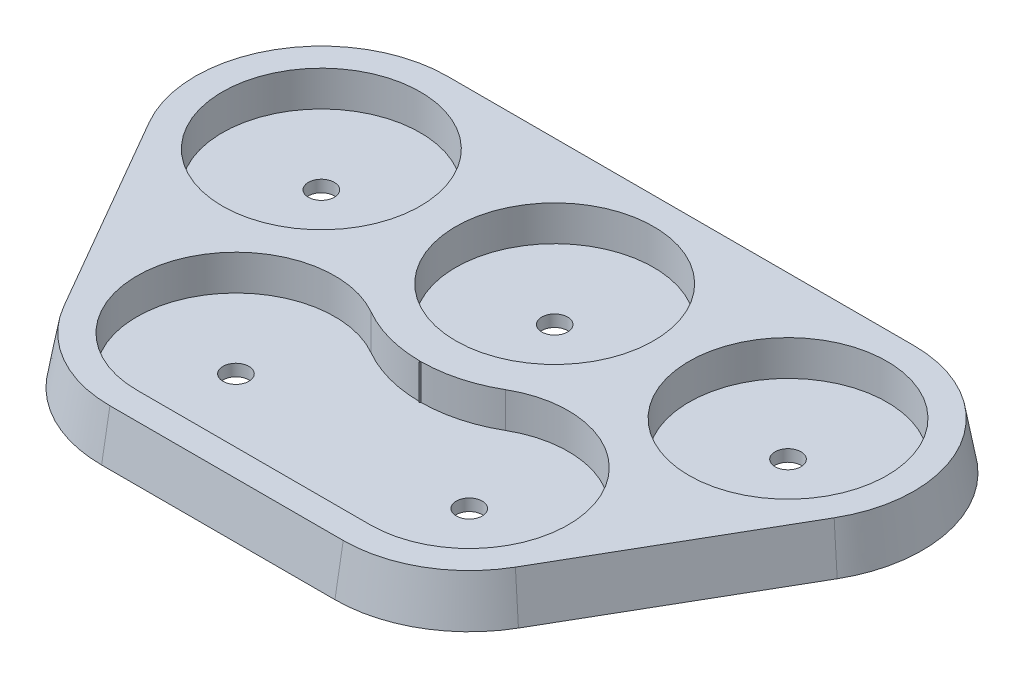
ISO-10303-21;
HEADER;
FILE_DESCRIPTION(('STEP AP214'),'2;1');
FILE_NAME('part.step','',(''),(''),'','','');
FILE_SCHEMA(('AUTOMOTIVE_DESIGN { 1 0 10303 214 1 1 1 1 }'));
ENDSEC;
DATA;
#1=APPLICATION_CONTEXT('core data for automotive mechanical design processes');
#2=APPLICATION_PROTOCOL_DEFINITION('international standard','automotive_design',2000,#1);
#3=PRODUCT_CONTEXT('',#1,'mechanical');
#4=PRODUCT('Part','Part','',(#3));
#5=PRODUCT_RELATED_PRODUCT_CATEGORY('part','',(#4));
#6=PRODUCT_DEFINITION_FORMATION('','',#4);
#7=PRODUCT_DEFINITION_CONTEXT('part definition',#1,'design');
#8=PRODUCT_DEFINITION('design','',#6,#7);
#9=PRODUCT_DEFINITION_SHAPE('','',#8);
#10=(LENGTH_UNIT() NAMED_UNIT(*) SI_UNIT(.MILLI.,.METRE.));
#11=(NAMED_UNIT(*) PLANE_ANGLE_UNIT() SI_UNIT($,.RADIAN.));
#12=(NAMED_UNIT(*) SI_UNIT($,.STERADIAN.) SOLID_ANGLE_UNIT());
#13=UNCERTAINTY_MEASURE_WITH_UNIT(LENGTH_MEASURE(1.E-05),#10,'distance_accuracy_value','');
#14=(GEOMETRIC_REPRESENTATION_CONTEXT(3) GLOBAL_UNCERTAINTY_ASSIGNED_CONTEXT((#13)) GLOBAL_UNIT_ASSIGNED_CONTEXT((#10,
#11,#12)) REPRESENTATION_CONTEXT('',''));
#15=CARTESIAN_POINT('',(0.,0.,0.));
#16=DIRECTION('',(0.,0.,1.));
#17=DIRECTION('',(1.,0.,0.));
#18=AXIS2_PLACEMENT_3D('',#15,#16,#17);
#19=CARTESIAN_POINT('',(0.,4.,0.));
#20=DIRECTION('',(0.,1.,0.));
#21=DIRECTION('',(0.,0.,1.));
#22=AXIS2_PLACEMENT_3D('',#19,#20,#21);
#23=PLANE('',#22);
#24=DIRECTION('',(-0.500000000000004,0.,0.866025403784436));
#25=VECTOR('',#24,1.);
#26=CARTESIAN_POINT('',(9.26187502447802,4.,5.34734603858312));
#27=LINE('',#26,#25);
#28=CARTESIAN_POINT('',(9.26187502447802,4.,5.34734603858311));
#29=VERTEX_POINT('',#28);
#30=CARTESIAN_POINT('',(-0.63812497552206,4.,22.494649033515));
#31=VERTEX_POINT('',#30);
#32=EDGE_CURVE('E363',#29,#31,#27,.T.);
#33=ORIENTED_EDGE('',*,*,#32,.F.);
#34=CARTESIAN_POINT('',(0.,4.,0.));
#35=DIRECTION('',(0.,1.,0.));
#36=DIRECTION('',(0.,0.,1.));
#37=AXIS2_PLACEMENT_3D('',#34,#35,#36);
#38=CIRCLE('',#37,10.6946920771661);
#39=CARTESIAN_POINT('',(0.,4.,-10.6946920771661));
#40=VERTEX_POINT('',#39);
#41=EDGE_CURVE('E392',#29,#40,#38,.T.);
#42=ORIENTED_EDGE('',*,*,#41,.T.);
#43=DIRECTION('',(1.,0.,0.));
#44=VECTOR('',#43,1.);
#45=CARTESIAN_POINT('',(0.,4.,-10.6946920771661));
#46=LINE('',#45,#44);
#47=CARTESIAN_POINT('',(-39.5999999999999,4.,-10.6946920771664));
#48=VERTEX_POINT('',#47);
#49=EDGE_CURVE('E395',#40,#48,#46,.F.);
#50=ORIENTED_EDGE('',*,*,#49,.T.);
#51=CARTESIAN_POINT('',(-39.5999999999999,4.,-2.72581957005969E-13));
#52=DIRECTION('',(0.,1.,0.));
#53=DIRECTION('',(0.,0.,1.));
#54=AXIS2_PLACEMENT_3D('',#51,#52,#53);
#55=CIRCLE('',#54,10.6946920771662);
#56=CARTESIAN_POINT('',(-48.8618750244779,4.,5.34734603858271));
#57=VERTEX_POINT('',#56);
#58=EDGE_CURVE('E398',#48,#57,#55,.T.);
#59=ORIENTED_EDGE('',*,*,#58,.T.);
#60=DIRECTION('',(-0.499999999999993,0.,-0.866025403784443));
#61=VECTOR('',#60,1.);
#62=CARTESIAN_POINT('',(-38.9618750244781,4.,22.4946490335146));
#63=LINE('',#62,#61);
#64=CARTESIAN_POINT('',(-38.961875024478,4.,22.4946490335148));
#65=VERTEX_POINT('',#64);
#66=EDGE_CURVE('E401',#57,#65,#63,.F.);
#67=ORIENTED_EDGE('',*,*,#66,.T.);
#68=CARTESIAN_POINT('',(-29.6999999999999,4.,17.1473029949318));
#69=DIRECTION('',(0.,1.,0.));
#70=DIRECTION('',(0.,0.,1.));
#71=AXIS2_PLACEMENT_3D('',#68,#69,#70);
#72=CIRCLE('',#71,10.6946920771661);
#73=CARTESIAN_POINT('',(-29.6999999999999,4.,27.841995072098));
#74=VERTEX_POINT('',#73);
#75=EDGE_CURVE('E404',#65,#74,#72,.T.);
#76=ORIENTED_EDGE('',*,*,#75,.T.);
#77=DIRECTION('',(-1.,0.,0.));
#78=VECTOR('',#77,1.);
#79=CARTESIAN_POINT('',(0.,4.,27.841995072098));
#80=LINE('',#79,#78);
#81=CARTESIAN_POINT('',(-9.90000000000008,4.,27.841995072098));
#82=VERTEX_POINT('',#81);
#83=EDGE_CURVE('E406',#82,#74,#80,.T.);
#84=ORIENTED_EDGE('',*,*,#83,.F.);
#85=CARTESIAN_POINT('',(-9.90000000000008,4.,17.1473029949318));
#86=DIRECTION('',(0.,1.,0.));
#87=DIRECTION('',(0.,0.,1.));
#88=AXIS2_PLACEMENT_3D('',#85,#86,#87);
#89=CIRCLE('',#88,10.6946920771661);
#90=EDGE_CURVE('E111',#82,#31,#89,.T.);
#91=ORIENTED_EDGE('',*,*,#90,.T.);
#92=EDGE_LOOP('',(#33,#42,#50,#59,#67,#76,#84,#91));
#93=FACE_BOUND('',#92,.T.);
#94=CARTESIAN_POINT('',(-19.7999999999998,4.,0.));
#95=DIRECTION('',(0.,1.,0.));
#96=DIRECTION('',(0.,0.,1.));
#97=AXIS2_PLACEMENT_3D('',#94,#95,#96);
#98=CIRCLE('',#97,8.40000000000001);
#99=CARTESIAN_POINT('',(-19.7999999999998,4.,8.40000000000001));
#100=VERTEX_POINT('',#99);
#101=EDGE_CURVE('E307',#100,#100,#98,.T.);
#102=ORIENTED_EDGE('',*,*,#101,.F.);
#103=EDGE_LOOP('',(#102));
#104=FACE_BOUND('',#103,.T.);
#105=CARTESIAN_POINT('',(0.,4.,0.));
#106=DIRECTION('',(0.,1.,0.));
#107=DIRECTION('',(0.,0.,1.));
#108=AXIS2_PLACEMENT_3D('',#105,#106,#107);
#109=CIRCLE('',#108,8.4);
#110=CARTESIAN_POINT('',(0.,4.,8.4));
#111=VERTEX_POINT('',#110);
#112=EDGE_CURVE('E826',#111,#111,#109,.T.);
#113=ORIENTED_EDGE('',*,*,#112,.F.);
#114=EDGE_LOOP('',(#113));
#115=FACE_BOUND('',#114,.T.);
#116=CARTESIAN_POINT('',(-39.5999999999999,4.,-2.72581957005969E-13));
#117=DIRECTION('',(0.,1.,0.));
#118=DIRECTION('',(0.,0.,1.));
#119=AXIS2_PLACEMENT_3D('',#116,#117,#118);
#120=CIRCLE('',#119,8.40000000000002);
#121=CARTESIAN_POINT('',(-39.5999999999999,4.,8.39999999999974));
#122=VERTEX_POINT('',#121);
#123=EDGE_CURVE('E834',#122,#122,#120,.T.);
#124=ORIENTED_EDGE('',*,*,#123,.F.);
#125=EDGE_LOOP('',(#124));
#126=FACE_BOUND('',#125,.T.);
#127=CARTESIAN_POINT('',(-29.6999999999999,4.,17.1473029949318));
#128=DIRECTION('',(0.,1.,0.));
#129=DIRECTION('',(0.,0.,1.));
#130=AXIS2_PLACEMENT_3D('',#127,#128,#129);
#131=CIRCLE('',#130,8.4);
#132=CARTESIAN_POINT('',(-25.4999999999999,4.,9.87268960314258));
#133=VERTEX_POINT('',#132);
#134=CARTESIAN_POINT('',(-29.6999999999999,4.,25.5473029949318));
#135=VERTEX_POINT('',#134);
#136=EDGE_CURVE('E227',#133,#135,#131,.T.);
#137=ORIENTED_EDGE('',*,*,#136,.F.);
#138=CARTESIAN_POINT('',(-19.7999999999998,4.,0.));
#139=DIRECTION('',(0.,1.,0.));
#140=DIRECTION('',(0.,0.,1.));
#141=AXIS2_PLACEMENT_3D('',#138,#139,#140);
#142=CIRCLE('',#141,11.4);
#143=CARTESIAN_POINT('',(-19.8548493383757,4.,11.3998680496785));
#144=VERTEX_POINT('',#143);
#145=EDGE_CURVE('E125',#133,#144,#142,.T.);
#146=ORIENTED_EDGE('',*,*,#145,.T.);
#147=CARTESIAN_POINT('',(-29.6999999999999,4.,17.1473029949318));
#148=DIRECTION('',(0.,1.,0.));
#149=DIRECTION('',(0.,0.,1.));
#150=AXIS2_PLACEMENT_3D('',#147,#148,#149);
#151=CIRCLE('',#150,11.4);
#152=CARTESIAN_POINT('',(-19.8,4.,11.4948698905067));
#153=VERTEX_POINT('',#152);
#154=EDGE_CURVE('E234',#153,#144,#151,.T.);
#155=ORIENTED_EDGE('',*,*,#154,.F.);
#156=CARTESIAN_POINT('',(-9.90000000000008,4.,17.1473029949318));
#157=DIRECTION('',(0.,1.,0.));
#158=DIRECTION('',(0.,0.,1.));
#159=AXIS2_PLACEMENT_3D('',#156,#157,#158);
#160=CIRCLE('',#159,11.4);
#161=CARTESIAN_POINT('',(-19.7451506616243,4.,11.3998680496785));
#162=VERTEX_POINT('',#161);
#163=EDGE_CURVE('E268',#162,#153,#160,.T.);
#164=ORIENTED_EDGE('',*,*,#163,.F.);
#165=CARTESIAN_POINT('',(-19.7999999999998,4.,0.));
#166=DIRECTION('',(0.,1.,0.));
#167=DIRECTION('',(0.,0.,1.));
#168=AXIS2_PLACEMENT_3D('',#165,#166,#167);
#169=CIRCLE('',#168,11.4);
#170=CARTESIAN_POINT('',(-14.0999999999999,4.,9.87268960314266));
#171=VERTEX_POINT('',#170);
#172=EDGE_CURVE('E272',#162,#171,#169,.T.);
#173=ORIENTED_EDGE('',*,*,#172,.T.);
#174=CARTESIAN_POINT('',(-9.90000000000008,4.,17.1473029949318));
#175=DIRECTION('',(0.,1.,0.));
#176=DIRECTION('',(0.,0.,1.));
#177=AXIS2_PLACEMENT_3D('',#174,#175,#176);
#178=CIRCLE('',#177,8.4);
#179=CARTESIAN_POINT('',(-9.90000000000008,4.,25.5473029949318));
#180=VERTEX_POINT('',#179);
#181=EDGE_CURVE('E276',#180,#171,#178,.T.);
#182=ORIENTED_EDGE('',*,*,#181,.F.);
#183=DIRECTION('',(1.,0.,0.));
#184=VECTOR('',#183,1.);
#185=CARTESIAN_POINT('',(0.,4.,25.5473029949319));
#186=LINE('',#185,#184);
#187=EDGE_CURVE('E280',#135,#180,#186,.T.);
#188=ORIENTED_EDGE('',*,*,#187,.F.);
#189=EDGE_LOOP('',(#137,#146,#155,#164,#173,#182,#188));
#190=FACE_BOUND('',#189,.T.);
#191=ADVANCED_FACE('F107',(#93,#104,#115,#126,#190),#23,.T.);
#192=CARTESIAN_POINT('',(-9.90000000000008,0.,17.1473029949318));
#193=DIRECTION('',(0.,1.,0.));
#194=DIRECTION('',(0.,0.,1.));
#195=AXIS2_PLACEMENT_3D('',#192,#193,#194);
#196=CYLINDRICAL_SURFACE('',#195,1.1);
#197=CARTESIAN_POINT('',(-9.90000000000008,0.,17.1473029949318));
#198=DIRECTION('',(0.,1.,0.));
#199=DIRECTION('',(0.,0.,1.));
#200=AXIS2_PLACEMENT_3D('',#197,#198,#199);
#201=CIRCLE('',#200,1.1);
#202=CARTESIAN_POINT('',(-9.90000000000008,0.,18.2473029949318));
#203=VERTEX_POINT('',#202);
#204=EDGE_CURVE('E329',#203,#203,#201,.T.);
#205=ORIENTED_EDGE('',*,*,#204,.F.);
#206=EDGE_LOOP('',(#205));
#207=FACE_BOUND('',#206,.T.);
#208=CARTESIAN_POINT('',(-9.90000000000008,1.,17.1473029949318));
#209=DIRECTION('',(0.,1.,0.));
#210=DIRECTION('',(0.,0.,1.));
#211=AXIS2_PLACEMENT_3D('',#208,#209,#210);
#212=CIRCLE('',#211,1.1);
#213=CARTESIAN_POINT('',(-9.90000000000008,1.,18.2473029949318));
#214=VERTEX_POINT('',#213);
#215=EDGE_CURVE('E846',#214,#214,#212,.T.);
#216=ORIENTED_EDGE('',*,*,#215,.T.);
#217=EDGE_LOOP('',(#216));
#218=FACE_BOUND('',#217,.T.);
#219=ADVANCED_FACE('F455',(#207,#218),#196,.F.);
#220=CARTESIAN_POINT('',(-19.7999999999998,0.,0.));
#221=DIRECTION('',(0.,1.,0.));
#222=DIRECTION('',(0.,0.,1.));
#223=AXIS2_PLACEMENT_3D('',#220,#221,#222);
#224=CYLINDRICAL_SURFACE('',#223,1.10000000000001);
#225=CARTESIAN_POINT('',(-19.7999999999998,0.,0.));
#226=DIRECTION('',(0.,1.,0.));
#227=DIRECTION('',(0.,0.,1.));
#228=AXIS2_PLACEMENT_3D('',#225,#226,#227);
#229=CIRCLE('',#228,1.10000000000001);
#230=CARTESIAN_POINT('',(-19.7999999999998,0.,1.10000000000001));
#231=VERTEX_POINT('',#230);
#232=EDGE_CURVE('E313',#231,#231,#229,.T.);
#233=ORIENTED_EDGE('',*,*,#232,.F.);
#234=EDGE_LOOP('',(#233));
#235=FACE_BOUND('',#234,.T.);
#236=CARTESIAN_POINT('',(-19.7999999999998,1.,0.));
#237=DIRECTION('',(0.,1.,0.));
#238=DIRECTION('',(0.,0.,1.));
#239=AXIS2_PLACEMENT_3D('',#236,#237,#238);
#240=CIRCLE('',#239,1.10000000000001);
#241=CARTESIAN_POINT('',(-19.7999999999998,1.,1.10000000000001));
#242=VERTEX_POINT('',#241);
#243=EDGE_CURVE('E303',#242,#242,#240,.T.);
#244=ORIENTED_EDGE('',*,*,#243,.T.);
#245=EDGE_LOOP('',(#244));
#246=FACE_BOUND('',#245,.T.);
#247=ADVANCED_FACE('F460',(#235,#246),#224,.F.);
#248=CARTESIAN_POINT('',(-39.5999999999999,0.,-2.72581957005969E-13));
#249=DIRECTION('',(0.,1.,0.));
#250=DIRECTION('',(0.,0.,1.));
#251=AXIS2_PLACEMENT_3D('',#248,#249,#250);
#252=CYLINDRICAL_SURFACE('',#251,1.10000000000001);
#253=CARTESIAN_POINT('',(-39.5999999999999,0.,-2.72581957005969E-13));
#254=DIRECTION('',(0.,1.,0.));
#255=DIRECTION('',(0.,0.,1.));
#256=AXIS2_PLACEMENT_3D('',#253,#254,#255);
#257=CIRCLE('',#256,1.10000000000001);
#258=CARTESIAN_POINT('',(-39.5999999999999,0.,1.09999999999974));
#259=VERTEX_POINT('',#258);
#260=EDGE_CURVE('E317',#259,#259,#257,.T.);
#261=ORIENTED_EDGE('',*,*,#260,.F.);
#262=EDGE_LOOP('',(#261));
#263=FACE_BOUND('',#262,.T.);
#264=CARTESIAN_POINT('',(-39.5999999999999,1.,-2.72581957005969E-13));
#265=DIRECTION('',(0.,1.,0.));
#266=DIRECTION('',(0.,0.,1.));
#267=AXIS2_PLACEMENT_3D('',#264,#265,#266);
#268=CIRCLE('',#267,1.10000000000001);
#269=CARTESIAN_POINT('',(-39.5999999999999,1.,1.09999999999974));
#270=VERTEX_POINT('',#269);
#271=EDGE_CURVE('E236',#270,#270,#268,.T.);
#272=ORIENTED_EDGE('',*,*,#271,.T.);
#273=EDGE_LOOP('',(#272));
#274=FACE_BOUND('',#273,.T.);
#275=ADVANCED_FACE('F662',(#263,#274),#252,.F.);
#276=CARTESIAN_POINT('',(-29.6999999999999,0.,17.1473029949318));
#277=DIRECTION('',(0.,1.,0.));
#278=DIRECTION('',(0.,0.,1.));
#279=AXIS2_PLACEMENT_3D('',#276,#277,#278);
#280=CYLINDRICAL_SURFACE('',#279,1.1);
#281=CARTESIAN_POINT('',(-29.6999999999999,0.,17.1473029949318));
#282=DIRECTION('',(0.,1.,0.));
#283=DIRECTION('',(0.,0.,1.));
#284=AXIS2_PLACEMENT_3D('',#281,#282,#283);
#285=CIRCLE('',#284,1.1);
#286=CARTESIAN_POINT('',(-29.6999999999999,0.,18.2473029949318));
#287=VERTEX_POINT('',#286);
#288=EDGE_CURVE('E321',#287,#287,#285,.T.);
#289=ORIENTED_EDGE('',*,*,#288,.F.);
#290=EDGE_LOOP('',(#289));
#291=FACE_BOUND('',#290,.T.);
#292=CARTESIAN_POINT('',(-29.6999999999999,1.,17.1473029949318));
#293=DIRECTION('',(0.,1.,0.));
#294=DIRECTION('',(0.,0.,1.));
#295=AXIS2_PLACEMENT_3D('',#292,#293,#294);
#296=CIRCLE('',#295,1.1);
#297=CARTESIAN_POINT('',(-29.6999999999999,1.,18.2473029949318));
#298=VERTEX_POINT('',#297);
#299=EDGE_CURVE('E265',#298,#298,#296,.T.);
#300=ORIENTED_EDGE('',*,*,#299,.T.);
#301=EDGE_LOOP('',(#300));
#302=FACE_BOUND('',#301,.T.);
#303=ADVANCED_FACE('F672',(#291,#302),#280,.F.);
#304=CARTESIAN_POINT('',(0.,0.,0.));
#305=DIRECTION('',(0.,1.,0.));
#306=DIRECTION('',(0.,0.,1.));
#307=AXIS2_PLACEMENT_3D('',#304,#305,#306);
#308=CYLINDRICAL_SURFACE('',#307,1.1);
#309=CARTESIAN_POINT('',(0.,0.,0.));
#310=DIRECTION('',(0.,1.,0.));
#311=DIRECTION('',(0.,0.,1.));
#312=AXIS2_PLACEMENT_3D('',#309,#310,#311);
#313=CIRCLE('',#312,1.1);
#314=CARTESIAN_POINT('',(0.,0.,1.1));
#315=VERTEX_POINT('',#314);
#316=EDGE_CURVE('E325',#315,#315,#313,.T.);
#317=ORIENTED_EDGE('',*,*,#316,.F.);
#318=EDGE_LOOP('',(#317));
#319=FACE_BOUND('',#318,.T.);
#320=CARTESIAN_POINT('',(0.,1.,0.));
#321=DIRECTION('',(0.,1.,0.));
#322=DIRECTION('',(0.,0.,1.));
#323=AXIS2_PLACEMENT_3D('',#320,#321,#322);
#324=CIRCLE('',#323,1.1);
#325=CARTESIAN_POINT('',(0.,1.,1.1));
#326=VERTEX_POINT('',#325);
#327=EDGE_CURVE('E824',#326,#326,#324,.T.);
#328=ORIENTED_EDGE('',*,*,#327,.T.);
#329=EDGE_LOOP('',(#328));
#330=FACE_BOUND('',#329,.T.);
#331=ADVANCED_FACE('F471',(#319,#330),#308,.F.);
#332=CARTESIAN_POINT('',(9.87268960314258,0.,5.70000000000005));
#333=DIRECTION('',(0.852868531952441,0.173648177666931,0.492403876506108));
#334=DIRECTION('',(0.500000000000004,0.,-0.866025403784436));
#335=AXIS2_PLACEMENT_3D('',#332,#333,#334);
#336=PLANE('',#335);
#337=DIRECTION('',(-0.500000000000004,0.,0.866025403784436));
#338=VECTOR('',#337,1.);
#339=CARTESIAN_POINT('',(9.87268960314258,0.,5.70000000000005));
#340=LINE('',#339,#338);
#341=CARTESIAN_POINT('',(9.87268960314258,0.,5.70000000000005));
#342=VERTEX_POINT('',#341);
#343=CARTESIAN_POINT('',(-0.0273103968575052,0.,22.8473029949319));
#344=VERTEX_POINT('',#343);
#345=EDGE_CURVE('E336',#342,#344,#340,.T.);
#346=ORIENTED_EDGE('',*,*,#345,.F.);
#347=DIRECTION('',(0.150383733180435,-0.984807753012208,0.0868240888334661));
#348=VECTOR('',#347,1.);
#349=CARTESIAN_POINT('',(9.87268960314258,0.,5.70000000000004));
#350=LINE('',#349,#348);
#351=EDGE_CURVE('E12',#29,#342,#350,.T.);
#352=ORIENTED_EDGE('',*,*,#351,.F.);
#353=ORIENTED_EDGE('',*,*,#32,.T.);
#354=DIRECTION('',(0.150383733180435,-0.984807753012208,0.0868240888334661));
#355=VECTOR('',#354,1.);
#356=CARTESIAN_POINT('',(-0.0273103968575027,0.,22.8473029949319));
#357=LINE('',#356,#355);
#358=EDGE_CURVE('E365',#31,#344,#357,.T.);
#359=ORIENTED_EDGE('',*,*,#358,.T.);
#360=EDGE_LOOP('',(#346,#352,#353,#359));
#361=FACE_BOUND('',#360,.T.);
#362=ADVANCED_FACE('F430',(#361),#336,.T.);
#363=CARTESIAN_POINT('',(0.,0.,0.));
#364=DIRECTION('',(0.,-1.,0.));
#365=DIRECTION('',(0.,0.,1.));
#366=AXIS2_PLACEMENT_3D('',#363,#364,#365);
#367=CONICAL_SURFACE('',#366,11.4,0.174532925199433);
#368=CARTESIAN_POINT('',(0.,0.,0.));
#369=DIRECTION('',(0.,1.,0.));
#370=DIRECTION('',(0.,0.,1.));
#371=AXIS2_PLACEMENT_3D('',#368,#369,#370);
#372=CIRCLE('',#371,11.4);
#373=CARTESIAN_POINT('',(0.,0.,-11.4));
#374=VERTEX_POINT('',#373);
#375=EDGE_CURVE('E340',#342,#374,#372,.T.);
#376=ORIENTED_EDGE('',*,*,#375,.T.);
#377=DIRECTION('',(0.,-0.984807753012208,-0.173648177666931));
#378=VECTOR('',#377,1.);
#379=CARTESIAN_POINT('',(0.,0.,-11.4));
#380=LINE('',#379,#378);
#381=EDGE_CURVE('E117',#40,#374,#380,.T.);
#382=ORIENTED_EDGE('',*,*,#381,.F.);
#383=ORIENTED_EDGE('',*,*,#41,.F.);
#384=ORIENTED_EDGE('',*,*,#351,.T.);
#385=EDGE_LOOP('',(#376,#382,#383,#384));
#386=FACE_BOUND('',#385,.T.);
#387=ADVANCED_FACE('F109',(#386),#367,.T.);
#388=CARTESIAN_POINT('',(0.,0.,-11.4));
#389=DIRECTION('',(0.,0.173648177666931,-0.984807753012208));
#390=DIRECTION('',(0.,0.984807753012208,0.173648177666931));
#391=AXIS2_PLACEMENT_3D('',#388,#389,#390);
#392=PLANE('',#391);
#393=DIRECTION('',(-1.,0.,0.));
#394=VECTOR('',#393,1.);
#395=CARTESIAN_POINT('',(0.,0.,-11.4));
#396=LINE('',#395,#394);
#397=CARTESIAN_POINT('',(-39.5999999999999,0.,-11.4000000000003));
#398=VERTEX_POINT('',#397);
#399=EDGE_CURVE('E343',#374,#398,#396,.T.);
#400=ORIENTED_EDGE('',*,*,#399,.T.);
#401=DIRECTION('',(0.,-0.984807753012208,-0.173648177666931));
#402=VECTOR('',#401,1.);
#403=CARTESIAN_POINT('',(-39.5999999999999,0.,-11.4000000000003));
#404=LINE('',#403,#402);
#405=EDGE_CURVE('E382',#48,#398,#404,.T.);
#406=ORIENTED_EDGE('',*,*,#405,.F.);
#407=ORIENTED_EDGE('',*,*,#49,.F.);
#408=ORIENTED_EDGE('',*,*,#381,.T.);
#409=EDGE_LOOP('',(#400,#406,#407,#408));
#410=FACE_BOUND('',#409,.T.);
#411=ADVANCED_FACE('F438',(#410),#392,.T.);
#412=CARTESIAN_POINT('',(-39.5999999999999,0.,-2.72581957005969E-13));
#413=DIRECTION('',(0.,-1.,0.));
#414=DIRECTION('',(0.,0.,1.));
#415=AXIS2_PLACEMENT_3D('',#412,#413,#414);
#416=CONICAL_SURFACE('',#415,11.4,0.174532925199433);
#417=CARTESIAN_POINT('',(-39.5999999999999,0.,-2.72581957005969E-13));
#418=DIRECTION('',(0.,1.,0.));
#419=DIRECTION('',(0.,0.,1.));
#420=AXIS2_PLACEMENT_3D('',#417,#418,#419);
#421=CIRCLE('',#420,11.4);
#422=CARTESIAN_POINT('',(-49.4726896031425,0.,5.69999999999964));
#423=VERTEX_POINT('',#422);
#424=EDGE_CURVE('E346',#398,#423,#421,.T.);
#425=ORIENTED_EDGE('',*,*,#424,.T.);
#426=DIRECTION('',(-0.150383733180436,-0.984807753012208,0.0868240888334641));
#427=VECTOR('',#426,1.);
#428=CARTESIAN_POINT('',(-49.4726896031425,0.,5.69999999999963));
#429=LINE('',#428,#427);
#430=EDGE_CURVE('E378',#57,#423,#429,.T.);
#431=ORIENTED_EDGE('',*,*,#430,.F.);
#432=ORIENTED_EDGE('',*,*,#58,.F.);
#433=ORIENTED_EDGE('',*,*,#405,.T.);
#434=EDGE_LOOP('',(#425,#431,#432,#433));
#435=FACE_BOUND('',#434,.T.);
#436=ADVANCED_FACE('F443',(#435),#416,.T.);
#437=CARTESIAN_POINT('',(-39.5726896031427,0.,22.8473029949315));
#438=DIRECTION('',(-0.852868531952447,0.173648177666931,0.492403876506097));
#439=DIRECTION('',(0.499999999999993,0.,0.866025403784443));
#440=AXIS2_PLACEMENT_3D('',#437,#438,#439);
#441=PLANE('',#440);
#442=DIRECTION('',(0.499999999999993,0.,0.866025403784443));
#443=VECTOR('',#442,1.);
#444=CARTESIAN_POINT('',(-39.5726896031427,0.,22.8473029949315));
#445=LINE('',#444,#443);
#446=CARTESIAN_POINT('',(-39.5726896031426,0.,22.8473029949318));
#447=VERTEX_POINT('',#446);
#448=EDGE_CURVE('E349',#423,#447,#445,.T.);
#449=ORIENTED_EDGE('',*,*,#448,.T.);
#450=DIRECTION('',(-0.150383733180436,-0.984807753012208,0.0868240888334641));
#451=VECTOR('',#450,1.);
#452=CARTESIAN_POINT('',(-39.5726896031426,0.,22.8473029949318));
#453=LINE('',#452,#451);
#454=EDGE_CURVE('E374',#65,#447,#453,.T.);
#455=ORIENTED_EDGE('',*,*,#454,.F.);
#456=ORIENTED_EDGE('',*,*,#66,.F.);
#457=ORIENTED_EDGE('',*,*,#430,.T.);
#458=EDGE_LOOP('',(#449,#455,#456,#457));
#459=FACE_BOUND('',#458,.T.);
#460=ADVANCED_FACE('F445',(#459),#441,.T.);
#461=CARTESIAN_POINT('',(-29.6999999999999,0.,17.1473029949318));
#462=DIRECTION('',(0.,-1.,0.));
#463=DIRECTION('',(0.,0.,1.));
#464=AXIS2_PLACEMENT_3D('',#461,#462,#463);
#465=CONICAL_SURFACE('',#464,11.4,0.174532925199433);
#466=CARTESIAN_POINT('',(-29.6999999999999,0.,17.1473029949318));
#467=DIRECTION('',(0.,1.,0.));
#468=DIRECTION('',(0.,0.,1.));
#469=AXIS2_PLACEMENT_3D('',#466,#467,#468);
#470=CIRCLE('',#469,11.4);
#471=CARTESIAN_POINT('',(-29.6999999999999,0.,28.5473029949318));
#472=VERTEX_POINT('',#471);
#473=EDGE_CURVE('E352',#447,#472,#470,.T.);
#474=ORIENTED_EDGE('',*,*,#473,.T.);
#475=DIRECTION('',(0.,-0.984807753012208,0.173648177666931));
#476=VECTOR('',#475,1.);
#477=CARTESIAN_POINT('',(-29.6999999999999,0.,28.5473029949318));
#478=LINE('',#477,#476);
#479=EDGE_CURVE('E371',#74,#472,#478,.T.);
#480=ORIENTED_EDGE('',*,*,#479,.F.);
#481=ORIENTED_EDGE('',*,*,#75,.F.);
#482=ORIENTED_EDGE('',*,*,#454,.T.);
#483=EDGE_LOOP('',(#474,#480,#481,#482));
#484=FACE_BOUND('',#483,.T.);
#485=ADVANCED_FACE('F419',(#484),#465,.T.);
#486=CARTESIAN_POINT('',(0.,0.,28.5473029949318));
#487=DIRECTION('',(0.,0.173648177666931,0.984807753012208));
#488=DIRECTION('',(0.,-0.984807753012208,0.173648177666931));
#489=AXIS2_PLACEMENT_3D('',#486,#487,#488);
#490=PLANE('',#489);
#491=DIRECTION('',(-1.,0.,0.));
#492=VECTOR('',#491,1.);
#493=CARTESIAN_POINT('',(0.,0.,28.5473029949318));
#494=LINE('',#493,#492);
#495=CARTESIAN_POINT('',(-9.90000000000008,0.,28.5473029949318));
#496=VERTEX_POINT('',#495);
#497=EDGE_CURVE('E356',#496,#472,#494,.T.);
#498=ORIENTED_EDGE('',*,*,#497,.F.);
#499=DIRECTION('',(0.,-0.984807753012208,0.173648177666931));
#500=VECTOR('',#499,1.);
#501=CARTESIAN_POINT('',(-9.90000000000008,0.,28.5473029949318));
#502=LINE('',#501,#500);
#503=EDGE_CURVE('E368',#82,#496,#502,.T.);
#504=ORIENTED_EDGE('',*,*,#503,.F.);
#505=ORIENTED_EDGE('',*,*,#83,.T.);
#506=ORIENTED_EDGE('',*,*,#479,.T.);
#507=EDGE_LOOP('',(#498,#504,#505,#506));
#508=FACE_BOUND('',#507,.T.);
#509=ADVANCED_FACE('F412',(#508),#490,.T.);
#510=CARTESIAN_POINT('',(-9.90000000000008,0.,17.1473029949318));
#511=DIRECTION('',(0.,-1.,0.));
#512=DIRECTION('',(0.,0.,1.));
#513=AXIS2_PLACEMENT_3D('',#510,#511,#512);
#514=CONICAL_SURFACE('',#513,11.4,0.174532925199433);
#515=CARTESIAN_POINT('',(-9.90000000000008,0.,17.1473029949318));
#516=DIRECTION('',(0.,1.,0.));
#517=DIRECTION('',(0.,0.,1.));
#518=AXIS2_PLACEMENT_3D('',#515,#516,#517);
#519=CIRCLE('',#518,11.4);
#520=EDGE_CURVE('E360',#496,#344,#519,.T.);
#521=ORIENTED_EDGE('',*,*,#520,.T.);
#522=ORIENTED_EDGE('',*,*,#358,.F.);
#523=ORIENTED_EDGE('',*,*,#90,.F.);
#524=ORIENTED_EDGE('',*,*,#503,.T.);
#525=EDGE_LOOP('',(#521,#522,#523,#524));
#526=FACE_BOUND('',#525,.T.);
#527=ADVANCED_FACE('F428',(#526),#514,.T.);
#528=CARTESIAN_POINT('',(0.,0.,0.));
#529=DIRECTION('',(0.,1.,0.));
#530=DIRECTION('',(0.,0.,1.));
#531=AXIS2_PLACEMENT_3D('',#528,#529,#530);
#532=PLANE('',#531);
#533=ORIENTED_EDGE('',*,*,#316,.T.);
#534=EDGE_LOOP('',(#533));
#535=FACE_BOUND('',#534,.T.);
#536=ORIENTED_EDGE('',*,*,#288,.T.);
#537=EDGE_LOOP('',(#536));
#538=FACE_BOUND('',#537,.T.);
#539=ORIENTED_EDGE('',*,*,#260,.T.);
#540=EDGE_LOOP('',(#539));
#541=FACE_BOUND('',#540,.T.);
#542=ORIENTED_EDGE('',*,*,#232,.T.);
#543=EDGE_LOOP('',(#542));
#544=FACE_BOUND('',#543,.T.);
#545=ORIENTED_EDGE('',*,*,#204,.T.);
#546=EDGE_LOOP('',(#545));
#547=FACE_BOUND('',#546,.T.);
#548=ORIENTED_EDGE('',*,*,#345,.T.);
#549=ORIENTED_EDGE('',*,*,#520,.F.);
#550=ORIENTED_EDGE('',*,*,#497,.T.);
#551=ORIENTED_EDGE('',*,*,#473,.F.);
#552=ORIENTED_EDGE('',*,*,#448,.F.);
#553=ORIENTED_EDGE('',*,*,#424,.F.);
#554=ORIENTED_EDGE('',*,*,#399,.F.);
#555=ORIENTED_EDGE('',*,*,#375,.F.);
#556=EDGE_LOOP('',(#548,#549,#550,#551,#552,#553,#554,#555));
#557=FACE_BOUND('',#556,.T.);
#558=ADVANCED_FACE('F424',(#535,#538,#541,#544,#547,#557),#532,.F.);
#559=CARTESIAN_POINT('',(0.,1.,0.));
#560=DIRECTION('',(0.,1.,0.));
#561=DIRECTION('',(0.,0.,1.));
#562=AXIS2_PLACEMENT_3D('',#559,#560,#561);
#563=CYLINDRICAL_SURFACE('',#562,8.4);
#564=CARTESIAN_POINT('',(0.,1.,0.));
#565=DIRECTION('',(0.,1.,0.));
#566=DIRECTION('',(0.,0.,1.));
#567=AXIS2_PLACEMENT_3D('',#564,#565,#566);
#568=CIRCLE('',#567,8.4);
#569=CARTESIAN_POINT('',(0.,1.,8.4));
#570=VERTEX_POINT('',#569);
#571=EDGE_CURVE('E308',#570,#570,#568,.T.);
#572=ORIENTED_EDGE('',*,*,#571,.F.);
#573=EDGE_LOOP('',(#572));
#574=FACE_BOUND('',#573,.T.);
#575=ORIENTED_EDGE('',*,*,#112,.T.);
#576=EDGE_LOOP('',(#575));
#577=FACE_BOUND('',#576,.T.);
#578=ADVANCED_FACE('F467',(#574,#577),#563,.F.);
#579=CARTESIAN_POINT('',(0.,1.,0.));
#580=DIRECTION('',(0.,1.,0.));
#581=DIRECTION('',(0.,0.,1.));
#582=AXIS2_PLACEMENT_3D('',#579,#580,#581);
#583=PLANE('',#582);
#584=ORIENTED_EDGE('',*,*,#327,.F.);
#585=EDGE_LOOP('',(#584));
#586=FACE_BOUND('',#585,.T.);
#587=ORIENTED_EDGE('',*,*,#571,.T.);
#588=EDGE_LOOP('',(#587));
#589=FACE_BOUND('',#588,.T.);
#590=ADVANCED_FACE('F493',(#586,#589),#583,.T.);
#591=CARTESIAN_POINT('',(-19.7999999999998,1.,0.));
#592=DIRECTION('',(0.,1.,0.));
#593=DIRECTION('',(0.,0.,1.));
#594=AXIS2_PLACEMENT_3D('',#591,#592,#593);
#595=CYLINDRICAL_SURFACE('',#594,11.4);
#596=ORIENTED_EDGE('',*,*,#145,.F.);
#597=DIRECTION('',(0.,1.,0.));
#598=VECTOR('',#597,1.);
#599=CARTESIAN_POINT('',(-25.4999999999999,1.,9.87268960314258));
#600=LINE('',#599,#598);
#601=CARTESIAN_POINT('',(-25.4999999999999,1.,9.87268960314258));
#602=VERTEX_POINT('',#601);
#603=EDGE_CURVE('E220',#602,#133,#600,.T.);
#604=ORIENTED_EDGE('',*,*,#603,.F.);
#605=CARTESIAN_POINT('',(-19.7999999999998,1.,0.));
#606=DIRECTION('',(0.,1.,0.));
#607=DIRECTION('',(0.,0.,1.));
#608=AXIS2_PLACEMENT_3D('',#605,#606,#607);
#609=CIRCLE('',#608,11.4);
#610=CARTESIAN_POINT('',(-19.8548493383757,1.,11.3998680496785));
#611=VERTEX_POINT('',#610);
#612=EDGE_CURVE('E215',#602,#611,#609,.T.);
#613=ORIENTED_EDGE('',*,*,#612,.T.);
#614=DIRECTION('',(0.,1.,0.));
#615=VECTOR('',#614,1.);
#616=CARTESIAN_POINT('',(-19.8548493383757,1.,11.3998680496785));
#617=LINE('',#616,#615);
#618=EDGE_CURVE('E218',#611,#144,#617,.T.);
#619=ORIENTED_EDGE('',*,*,#618,.T.);
#620=EDGE_LOOP('',(#596,#604,#613,#619));
#621=FACE_BOUND('',#620,.T.);
#622=ADVANCED_FACE('F217',(#621),#595,.T.);
#623=CARTESIAN_POINT('',(-29.6999999999999,1.,17.1473029949318));
#624=DIRECTION('',(0.,1.,0.));
#625=DIRECTION('',(0.,0.,1.));
#626=AXIS2_PLACEMENT_3D('',#623,#624,#625);
#627=CYLINDRICAL_SURFACE('',#626,11.4);
#628=ORIENTED_EDGE('',*,*,#154,.T.);
#629=ORIENTED_EDGE('',*,*,#618,.F.);
#630=CARTESIAN_POINT('',(-29.6999999999999,1.,17.1473029949318));
#631=DIRECTION('',(0.,1.,0.));
#632=DIRECTION('',(0.,0.,1.));
#633=AXIS2_PLACEMENT_3D('',#630,#631,#632);
#634=CIRCLE('',#633,11.4);
#635=CARTESIAN_POINT('',(-19.8,1.,11.4948698905067));
#636=VERTEX_POINT('',#635);
#637=EDGE_CURVE('E226',#636,#611,#634,.T.);
#638=ORIENTED_EDGE('',*,*,#637,.F.);
#639=DIRECTION('',(0.,1.,0.));
#640=VECTOR('',#639,1.);
#641=CARTESIAN_POINT('',(-19.8,1.,11.4948698905067));
#642=LINE('',#641,#640);
#643=EDGE_CURVE('E237',#636,#153,#642,.T.);
#644=ORIENTED_EDGE('',*,*,#643,.T.);
#645=EDGE_LOOP('',(#628,#629,#638,#644));
#646=FACE_BOUND('',#645,.T.);
#647=ADVANCED_FACE('F231',(#646),#627,.F.);
#648=CARTESIAN_POINT('',(-9.90000000000008,1.,17.1473029949318));
#649=DIRECTION('',(0.,1.,0.));
#650=DIRECTION('',(0.,0.,1.));
#651=AXIS2_PLACEMENT_3D('',#648,#649,#650);
#652=CYLINDRICAL_SURFACE('',#651,11.4);
#653=ORIENTED_EDGE('',*,*,#163,.T.);
#654=ORIENTED_EDGE('',*,*,#643,.F.);
#655=CARTESIAN_POINT('',(-9.90000000000008,1.,17.1473029949318));
#656=DIRECTION('',(0.,1.,0.));
#657=DIRECTION('',(0.,0.,1.));
#658=AXIS2_PLACEMENT_3D('',#655,#656,#657);
#659=CIRCLE('',#658,11.4);
#660=CARTESIAN_POINT('',(-19.7451506616243,1.,11.3998680496785));
#661=VERTEX_POINT('',#660);
#662=EDGE_CURVE('E242',#661,#636,#659,.T.);
#663=ORIENTED_EDGE('',*,*,#662,.F.);
#664=DIRECTION('',(0.,1.,0.));
#665=VECTOR('',#664,1.);
#666=CARTESIAN_POINT('',(-19.7451506616243,1.,11.3998680496785));
#667=LINE('',#666,#665);
#668=EDGE_CURVE('E298',#661,#162,#667,.T.);
#669=ORIENTED_EDGE('',*,*,#668,.T.);
#670=EDGE_LOOP('',(#653,#654,#663,#669));
#671=FACE_BOUND('',#670,.T.);
#672=ADVANCED_FACE('F515',(#671),#652,.F.);
#673=CARTESIAN_POINT('',(-19.7999999999998,1.,0.));
#674=DIRECTION('',(0.,1.,0.));
#675=DIRECTION('',(0.,0.,1.));
#676=AXIS2_PLACEMENT_3D('',#673,#674,#675);
#677=CYLINDRICAL_SURFACE('',#676,11.4);
#678=ORIENTED_EDGE('',*,*,#172,.F.);
#679=ORIENTED_EDGE('',*,*,#668,.F.);
#680=CARTESIAN_POINT('',(-19.7999999999998,1.,0.));
#681=DIRECTION('',(0.,1.,0.));
#682=DIRECTION('',(0.,0.,1.));
#683=AXIS2_PLACEMENT_3D('',#680,#681,#682);
#684=CIRCLE('',#683,11.4);
#685=CARTESIAN_POINT('',(-14.0999999999999,1.,9.87268960314266));
#686=VERTEX_POINT('',#685);
#687=EDGE_CURVE('E246',#661,#686,#684,.T.);
#688=ORIENTED_EDGE('',*,*,#687,.T.);
#689=DIRECTION('',(0.,1.,0.));
#690=VECTOR('',#689,1.);
#691=CARTESIAN_POINT('',(-14.0999999999999,1.,9.87268960314266));
#692=LINE('',#691,#690);
#693=EDGE_CURVE('E295',#686,#171,#692,.T.);
#694=ORIENTED_EDGE('',*,*,#693,.T.);
#695=EDGE_LOOP('',(#678,#679,#688,#694));
#696=FACE_BOUND('',#695,.T.);
#697=ADVANCED_FACE('F522',(#696),#677,.T.);
#698=CARTESIAN_POINT('',(-9.90000000000008,1.,17.1473029949318));
#699=DIRECTION('',(0.,1.,0.));
#700=DIRECTION('',(0.,0.,1.));
#701=AXIS2_PLACEMENT_3D('',#698,#699,#700);
#702=CYLINDRICAL_SURFACE('',#701,8.4);
#703=ORIENTED_EDGE('',*,*,#181,.T.);
#704=ORIENTED_EDGE('',*,*,#693,.F.);
#705=CARTESIAN_POINT('',(-9.90000000000008,1.,17.1473029949318));
#706=DIRECTION('',(0.,1.,0.));
#707=DIRECTION('',(0.,0.,1.));
#708=AXIS2_PLACEMENT_3D('',#705,#706,#707);
#709=CIRCLE('',#708,8.4);
#710=CARTESIAN_POINT('',(-9.90000000000008,1.,25.5473029949318));
#711=VERTEX_POINT('',#710);
#712=EDGE_CURVE('E252',#711,#686,#709,.T.);
#713=ORIENTED_EDGE('',*,*,#712,.F.);
#714=DIRECTION('',(0.,1.,0.));
#715=VECTOR('',#714,1.);
#716=CARTESIAN_POINT('',(-9.90000000000008,1.,25.5473029949318));
#717=LINE('',#716,#715);
#718=EDGE_CURVE('E292',#711,#180,#717,.T.);
#719=ORIENTED_EDGE('',*,*,#718,.T.);
#720=EDGE_LOOP('',(#703,#704,#713,#719));
#721=FACE_BOUND('',#720,.T.);
#722=ADVANCED_FACE('F530',(#721),#702,.F.);
#723=CARTESIAN_POINT('',(0.,1.,25.5473029949319));
#724=DIRECTION('',(0.,0.,1.));
#725=DIRECTION('',(1.,0.,0.));
#726=AXIS2_PLACEMENT_3D('',#723,#724,#725);
#727=PLANE('',#726);
#728=ORIENTED_EDGE('',*,*,#187,.T.);
#729=ORIENTED_EDGE('',*,*,#718,.F.);
#730=DIRECTION('',(1.,0.,0.));
#731=VECTOR('',#730,1.);
#732=CARTESIAN_POINT('',(0.,1.,25.5473029949319));
#733=LINE('',#732,#731);
#734=CARTESIAN_POINT('',(-29.6999999999999,1.,25.5473029949318));
#735=VERTEX_POINT('',#734);
#736=EDGE_CURVE('E256',#735,#711,#733,.T.);
#737=ORIENTED_EDGE('',*,*,#736,.F.);
#738=DIRECTION('',(0.,1.,0.));
#739=VECTOR('',#738,1.);
#740=CARTESIAN_POINT('',(-29.6999999999999,1.,25.5473029949318));
#741=LINE('',#740,#739);
#742=EDGE_CURVE('E289',#735,#135,#741,.T.);
#743=ORIENTED_EDGE('',*,*,#742,.T.);
#744=EDGE_LOOP('',(#728,#729,#737,#743));
#745=FACE_BOUND('',#744,.T.);
#746=ADVANCED_FACE('F538',(#745),#727,.F.);
#747=CARTESIAN_POINT('',(-29.6999999999999,1.,17.1473029949318));
#748=DIRECTION('',(0.,1.,0.));
#749=DIRECTION('',(0.,0.,1.));
#750=AXIS2_PLACEMENT_3D('',#747,#748,#749);
#751=CYLINDRICAL_SURFACE('',#750,8.4);
#752=ORIENTED_EDGE('',*,*,#136,.T.);
#753=ORIENTED_EDGE('',*,*,#742,.F.);
#754=CARTESIAN_POINT('',(-29.6999999999999,1.,17.1473029949318));
#755=DIRECTION('',(0.,1.,0.));
#756=DIRECTION('',(0.,0.,1.));
#757=AXIS2_PLACEMENT_3D('',#754,#755,#756);
#758=CIRCLE('',#757,8.4);
#759=EDGE_CURVE('E260',#602,#735,#758,.T.);
#760=ORIENTED_EDGE('',*,*,#759,.F.);
#761=ORIENTED_EDGE('',*,*,#603,.T.);
#762=EDGE_LOOP('',(#752,#753,#760,#761));
#763=FACE_BOUND('',#762,.T.);
#764=ADVANCED_FACE('F546',(#763),#751,.F.);
#765=CARTESIAN_POINT('',(-19.7999999999998,1.,0.));
#766=DIRECTION('',(0.,1.,0.));
#767=DIRECTION('',(0.,0.,1.));
#768=AXIS2_PLACEMENT_3D('',#765,#766,#767);
#769=PLANE('',#768);
#770=ORIENTED_EDGE('',*,*,#215,.F.);
#771=EDGE_LOOP('',(#770));
#772=FACE_BOUND('',#771,.T.);
#773=ORIENTED_EDGE('',*,*,#299,.F.);
#774=EDGE_LOOP('',(#773));
#775=FACE_BOUND('',#774,.T.);
#776=ORIENTED_EDGE('',*,*,#612,.F.);
#777=ORIENTED_EDGE('',*,*,#759,.T.);
#778=ORIENTED_EDGE('',*,*,#736,.T.);
#779=ORIENTED_EDGE('',*,*,#712,.T.);
#780=ORIENTED_EDGE('',*,*,#687,.F.);
#781=ORIENTED_EDGE('',*,*,#662,.T.);
#782=ORIENTED_EDGE('',*,*,#637,.T.);
#783=EDGE_LOOP('',(#776,#777,#778,#779,#780,#781,#782));
#784=FACE_BOUND('',#783,.T.);
#785=ADVANCED_FACE('F239',(#772,#775,#784),#769,.T.);
#786=CARTESIAN_POINT('',(-39.5999999999999,1.,-2.72581957005969E-13));
#787=DIRECTION('',(0.,1.,0.));
#788=DIRECTION('',(0.,0.,1.));
#789=AXIS2_PLACEMENT_3D('',#786,#787,#788);
#790=CYLINDRICAL_SURFACE('',#789,8.40000000000002);
#791=CARTESIAN_POINT('',(-39.5999999999999,1.,-2.72581957005969E-13));
#792=DIRECTION('',(0.,1.,0.));
#793=DIRECTION('',(0.,0.,1.));
#794=AXIS2_PLACEMENT_3D('',#791,#792,#793);
#795=CIRCLE('',#794,8.40000000000002);
#796=CARTESIAN_POINT('',(-39.5999999999999,1.,8.39999999999974));
#797=VERTEX_POINT('',#796);
#798=EDGE_CURVE('E827',#797,#797,#795,.T.);
#799=ORIENTED_EDGE('',*,*,#798,.F.);
#800=EDGE_LOOP('',(#799));
#801=FACE_BOUND('',#800,.T.);
#802=ORIENTED_EDGE('',*,*,#123,.T.);
#803=EDGE_LOOP('',(#802));
#804=FACE_BOUND('',#803,.T.);
#805=ADVANCED_FACE('F561',(#801,#804),#790,.F.);
#806=CARTESIAN_POINT('',(-39.5999999999999,1.,-2.72581957005969E-13));
#807=DIRECTION('',(0.,1.,0.));
#808=DIRECTION('',(0.,0.,1.));
#809=AXIS2_PLACEMENT_3D('',#806,#807,#808);
#810=PLANE('',#809);
#811=ORIENTED_EDGE('',*,*,#271,.F.);
#812=EDGE_LOOP('',(#811));
#813=FACE_BOUND('',#812,.T.);
#814=ORIENTED_EDGE('',*,*,#798,.T.);
#815=EDGE_LOOP('',(#814));
#816=FACE_BOUND('',#815,.T.);
#817=ADVANCED_FACE('F569',(#813,#816),#810,.T.);
#818=CARTESIAN_POINT('',(-19.7999999999998,1.,0.));
#819=DIRECTION('',(0.,1.,0.));
#820=DIRECTION('',(0.,0.,1.));
#821=AXIS2_PLACEMENT_3D('',#818,#819,#820);
#822=CYLINDRICAL_SURFACE('',#821,8.40000000000001);
#823=CARTESIAN_POINT('',(-19.7999999999998,1.,0.));
#824=DIRECTION('',(0.,1.,0.));
#825=DIRECTION('',(0.,0.,1.));
#826=AXIS2_PLACEMENT_3D('',#823,#824,#825);
#827=CIRCLE('',#826,8.40000000000001);
#828=CARTESIAN_POINT('',(-19.7999999999998,1.,8.40000000000001));
#829=VERTEX_POINT('',#828);
#830=EDGE_CURVE('E309',#829,#829,#827,.T.);
#831=ORIENTED_EDGE('',*,*,#830,.F.);
#832=EDGE_LOOP('',(#831));
#833=FACE_BOUND('',#832,.T.);
#834=ORIENTED_EDGE('',*,*,#101,.T.);
#835=EDGE_LOOP('',(#834));
#836=FACE_BOUND('',#835,.T.);
#837=ADVANCED_FACE('F577',(#833,#836),#822,.F.);
#838=CARTESIAN_POINT('',(-19.7999999999998,1.,0.));
#839=DIRECTION('',(0.,1.,0.));
#840=DIRECTION('',(0.,0.,1.));
#841=AXIS2_PLACEMENT_3D('',#838,#839,#840);
#842=PLANE('',#841);
#843=ORIENTED_EDGE('',*,*,#243,.F.);
#844=EDGE_LOOP('',(#843));
#845=FACE_BOUND('',#844,.T.);
#846=ORIENTED_EDGE('',*,*,#830,.T.);
#847=EDGE_LOOP('',(#846));
#848=FACE_BOUND('',#847,.T.);
#849=ADVANCED_FACE('F585',(#845,#848),#842,.T.);
#850=CLOSED_SHELL('',(#191,#219,#247,#275,#303,#331,#362,#387,#411,#436,#460,#485,#509,#527,
#558,#578,#590,#622,#647,#672,#697,#722,#746,#764,#785,#805,#817,#837,#849));
#851=MANIFOLD_SOLID_BREP('B2',#850);
#852=ADVANCED_BREP_SHAPE_REPRESENTATION('',(#18,#851),#14);
#853=SHAPE_DEFINITION_REPRESENTATION(#9,#852);
ENDSEC;
END-ISO-10303-21;
